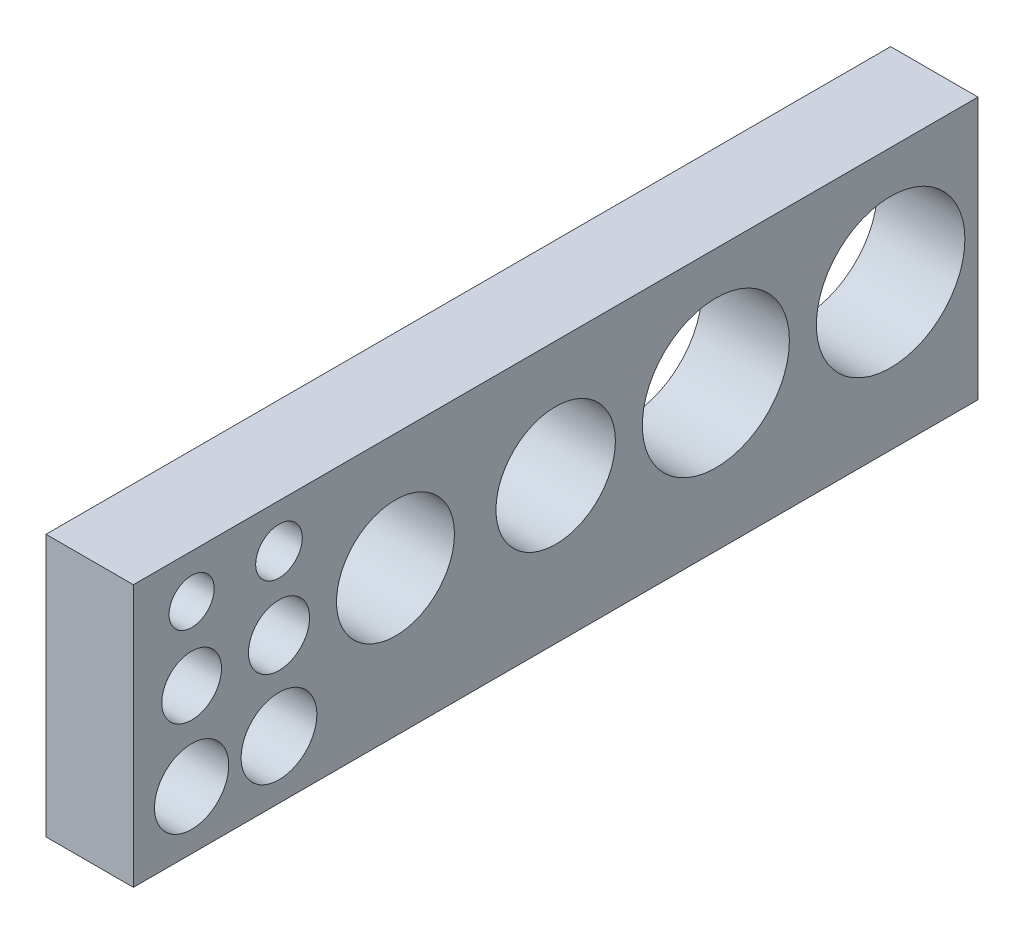
ISO-10303-21;
HEADER;
FILE_DESCRIPTION(('STEP AP214'),'2;1');
FILE_NAME('part.step','',(''),(''),'','','');
FILE_SCHEMA(('AUTOMOTIVE_DESIGN { 1 0 10303 214 1 1 1 1 }'));
ENDSEC;
DATA;
#1=APPLICATION_CONTEXT('core data for automotive mechanical design processes');
#2=APPLICATION_PROTOCOL_DEFINITION('international standard','automotive_design',2000,#1);
#3=PRODUCT_CONTEXT('',#1,'mechanical');
#4=PRODUCT('Part','Part','',(#3));
#5=PRODUCT_RELATED_PRODUCT_CATEGORY('part','',(#4));
#6=PRODUCT_DEFINITION_FORMATION('','',#4);
#7=PRODUCT_DEFINITION_CONTEXT('part definition',#1,'design');
#8=PRODUCT_DEFINITION('design','',#6,#7);
#9=PRODUCT_DEFINITION_SHAPE('','',#8);
#10=(LENGTH_UNIT() NAMED_UNIT(*) SI_UNIT(.MILLI.,.METRE.));
#11=(NAMED_UNIT(*) PLANE_ANGLE_UNIT() SI_UNIT($,.RADIAN.));
#12=(NAMED_UNIT(*) SI_UNIT($,.STERADIAN.) SOLID_ANGLE_UNIT());
#13=UNCERTAINTY_MEASURE_WITH_UNIT(LENGTH_MEASURE(1.E-05),#10,'distance_accuracy_value','');
#14=(GEOMETRIC_REPRESENTATION_CONTEXT(3) GLOBAL_UNCERTAINTY_ASSIGNED_CONTEXT((#13)) GLOBAL_UNIT_ASSIGNED_CONTEXT((#10,
#11,#12)) REPRESENTATION_CONTEXT('',''));
#15=CARTESIAN_POINT('',(0.,0.,0.));
#16=DIRECTION('',(0.,0.,1.));
#17=DIRECTION('',(1.,0.,0.));
#18=AXIS2_PLACEMENT_3D('',#15,#16,#17);
#19=CARTESIAN_POINT('',(6.,0.,0.));
#20=DIRECTION('',(1.,0.,0.));
#21=DIRECTION('',(0.,0.,-1.));
#22=AXIS2_PLACEMENT_3D('',#19,#20,#21);
#23=PLANE('',#22);
#24=CARTESIAN_POINT('',(6.,0.,-36.));
#25=DIRECTION('',(1.,0.,0.));
#26=DIRECTION('',(0.,0.,-1.));
#27=AXIS2_PLACEMENT_3D('',#24,#25,#26);
#28=CIRCLE('',#27,5.05);
#29=CARTESIAN_POINT('',(6.,0.,-41.05));
#30=VERTEX_POINT('',#29);
#31=EDGE_CURVE('E163',#30,#30,#28,.T.);
#32=ORIENTED_EDGE('',*,*,#31,.F.);
#33=EDGE_LOOP('',(#32));
#34=FACE_BOUND('',#33,.T.);
#35=CARTESIAN_POINT('',(6.,0.,-14.));
#36=DIRECTION('',(1.,0.,0.));
#37=DIRECTION('',(0.,0.,-1.));
#38=AXIS2_PLACEMENT_3D('',#35,#36,#37);
#39=CIRCLE('',#38,4.05);
#40=CARTESIAN_POINT('',(6.,0.,-18.05));
#41=VERTEX_POINT('',#40);
#42=EDGE_CURVE('E151',#41,#41,#39,.T.);
#43=ORIENTED_EDGE('',*,*,#42,.F.);
#44=EDGE_LOOP('',(#43));
#45=FACE_BOUND('',#44,.T.);
#46=CARTESIAN_POINT('',(6.,-6.,0.));
#47=DIRECTION('',(1.,0.,0.));
#48=DIRECTION('',(0.,0.,-1.));
#49=AXIS2_PLACEMENT_3D('',#46,#47,#48);
#50=CIRCLE('',#49,2.55);
#51=CARTESIAN_POINT('',(6.,-6.,-2.55));
#52=VERTEX_POINT('',#51);
#53=EDGE_CURVE('E139',#52,#52,#50,.T.);
#54=ORIENTED_EDGE('',*,*,#53,.F.);
#55=EDGE_LOOP('',(#54));
#56=FACE_BOUND('',#55,.T.);
#57=CARTESIAN_POINT('',(6.,5.,0.));
#58=DIRECTION('',(1.,0.,0.));
#59=DIRECTION('',(0.,0.,-1.));
#60=AXIS2_PLACEMENT_3D('',#57,#58,#59);
#61=CIRCLE('',#60,1.55);
#62=CARTESIAN_POINT('',(6.,5.,-1.55));
#63=VERTEX_POINT('',#62);
#64=EDGE_CURVE('E127',#63,#63,#61,.T.);
#65=ORIENTED_EDGE('',*,*,#64,.F.);
#66=EDGE_LOOP('',(#65));
#67=FACE_BOUND('',#66,.T.);
#68=CARTESIAN_POINT('',(6.,0.,0.));
#69=DIRECTION('',(1.,0.,0.));
#70=DIRECTION('',(0.,0.,-1.));
#71=AXIS2_PLACEMENT_3D('',#68,#69,#70);
#72=CIRCLE('',#71,2.05);
#73=CARTESIAN_POINT('',(6.,0.,-2.05));
#74=VERTEX_POINT('',#73);
#75=EDGE_CURVE('E106',#74,#74,#72,.T.);
#76=ORIENTED_EDGE('',*,*,#75,.F.);
#77=EDGE_LOOP('',(#76));
#78=FACE_BOUND('',#77,.T.);
#79=DIRECTION('',(0.,-1.,0.));
#80=VECTOR('',#79,1.);
#81=CARTESIAN_POINT('',(6.,8.,4.));
#82=LINE('',#81,#80);
#83=CARTESIAN_POINT('',(6.,8.,4.));
#84=VERTEX_POINT('',#83);
#85=CARTESIAN_POINT('',(6.,-10.,4.));
#86=VERTEX_POINT('',#85);
#87=EDGE_CURVE('E91',#84,#86,#82,.T.);
#88=ORIENTED_EDGE('',*,*,#87,.T.);
#89=DIRECTION('',(0.,0.,-1.));
#90=VECTOR('',#89,1.);
#91=CARTESIAN_POINT('',(6.,-10.,4.));
#92=LINE('',#91,#90);
#93=CARTESIAN_POINT('',(6.,-10.,-54.));
#94=VERTEX_POINT('',#93);
#95=EDGE_CURVE('E86',#86,#94,#92,.T.);
#96=ORIENTED_EDGE('',*,*,#95,.T.);
#97=DIRECTION('',(0.,1.,0.));
#98=VECTOR('',#97,1.);
#99=CARTESIAN_POINT('',(6.,8.,-54.));
#100=LINE('',#99,#98);
#101=CARTESIAN_POINT('',(6.,8.,-54.));
#102=VERTEX_POINT('',#101);
#103=EDGE_CURVE('E89',#94,#102,#100,.T.);
#104=ORIENTED_EDGE('',*,*,#103,.T.);
#105=DIRECTION('',(0.,0.,1.));
#106=VECTOR('',#105,1.);
#107=CARTESIAN_POINT('',(6.,8.,4.));
#108=LINE('',#107,#106);
#109=EDGE_CURVE('E56',#102,#84,#108,.T.);
#110=ORIENTED_EDGE('',*,*,#109,.T.);
#111=EDGE_LOOP('',(#88,#96,#104,#110));
#112=FACE_BOUND('',#111,.T.);
#113=CARTESIAN_POINT('',(6.,0.,-6.));
#114=DIRECTION('',(1.,0.,0.));
#115=DIRECTION('',(0.,0.,-1.));
#116=AXIS2_PLACEMENT_3D('',#113,#114,#115);
#117=CIRCLE('',#116,2.1);
#118=CARTESIAN_POINT('',(6.,0.,-8.1));
#119=VERTEX_POINT('',#118);
#120=EDGE_CURVE('E121',#119,#119,#117,.T.);
#121=ORIENTED_EDGE('',*,*,#120,.F.);
#122=EDGE_LOOP('',(#121));
#123=FACE_BOUND('',#122,.T.);
#124=CARTESIAN_POINT('',(6.,5.,-6.));
#125=DIRECTION('',(1.,0.,0.));
#126=DIRECTION('',(0.,0.,-1.));
#127=AXIS2_PLACEMENT_3D('',#124,#125,#126);
#128=CIRCLE('',#127,1.60000000000001);
#129=CARTESIAN_POINT('',(6.,5.,-7.6));
#130=VERTEX_POINT('',#129);
#131=EDGE_CURVE('E133',#130,#130,#128,.T.);
#132=ORIENTED_EDGE('',*,*,#131,.F.);
#133=EDGE_LOOP('',(#132));
#134=FACE_BOUND('',#133,.T.);
#135=CARTESIAN_POINT('',(6.,-6.,-6.));
#136=DIRECTION('',(1.,0.,0.));
#137=DIRECTION('',(0.,0.,-1.));
#138=AXIS2_PLACEMENT_3D('',#135,#136,#137);
#139=CIRCLE('',#138,2.6);
#140=CARTESIAN_POINT('',(6.,-6.,-8.6));
#141=VERTEX_POINT('',#140);
#142=EDGE_CURVE('E145',#141,#141,#139,.T.);
#143=ORIENTED_EDGE('',*,*,#142,.F.);
#144=EDGE_LOOP('',(#143));
#145=FACE_BOUND('',#144,.T.);
#146=CARTESIAN_POINT('',(6.,0.,-25.));
#147=DIRECTION('',(1.,0.,0.));
#148=DIRECTION('',(0.,0.,-1.));
#149=AXIS2_PLACEMENT_3D('',#146,#147,#148);
#150=CIRCLE('',#149,4.1);
#151=CARTESIAN_POINT('',(6.,0.,-29.1));
#152=VERTEX_POINT('',#151);
#153=EDGE_CURVE('E157',#152,#152,#150,.T.);
#154=ORIENTED_EDGE('',*,*,#153,.F.);
#155=EDGE_LOOP('',(#154));
#156=FACE_BOUND('',#155,.T.);
#157=CARTESIAN_POINT('',(6.,0.,-48.));
#158=DIRECTION('',(1.,0.,0.));
#159=DIRECTION('',(0.,0.,-1.));
#160=AXIS2_PLACEMENT_3D('',#157,#158,#159);
#161=CIRCLE('',#160,5.1);
#162=CARTESIAN_POINT('',(6.,0.,-53.1));
#163=VERTEX_POINT('',#162);
#164=EDGE_CURVE('E169',#163,#163,#161,.T.);
#165=ORIENTED_EDGE('',*,*,#164,.F.);
#166=EDGE_LOOP('',(#165));
#167=FACE_BOUND('',#166,.T.);
#168=ADVANCED_FACE('F39',(#34,#45,#56,#67,#78,#112,#123,#134,#145,#156,#167),#23,.T.);
#169=CARTESIAN_POINT('',(0.,0.,0.));
#170=DIRECTION('',(1.,0.,0.));
#171=DIRECTION('',(0.,0.,-1.));
#172=AXIS2_PLACEMENT_3D('',#169,#170,#171);
#173=PLANE('',#172);
#174=DIRECTION('',(0.,-1.,0.));
#175=VECTOR('',#174,1.);
#176=CARTESIAN_POINT('',(0.,8.,4.));
#177=LINE('',#176,#175);
#178=CARTESIAN_POINT('',(0.,8.,4.));
#179=VERTEX_POINT('',#178);
#180=CARTESIAN_POINT('',(0.,-10.,4.));
#181=VERTEX_POINT('',#180);
#182=EDGE_CURVE('E103',#179,#181,#177,.T.);
#183=ORIENTED_EDGE('',*,*,#182,.F.);
#184=DIRECTION('',(0.,0.,1.));
#185=VECTOR('',#184,1.);
#186=CARTESIAN_POINT('',(0.,8.,4.));
#187=LINE('',#186,#185);
#188=CARTESIAN_POINT('',(0.,8.,-54.));
#189=VERTEX_POINT('',#188);
#190=EDGE_CURVE('E79',#189,#179,#187,.T.);
#191=ORIENTED_EDGE('',*,*,#190,.F.);
#192=DIRECTION('',(0.,1.,0.));
#193=VECTOR('',#192,1.);
#194=CARTESIAN_POINT('',(0.,8.,-54.));
#195=LINE('',#194,#193);
#196=CARTESIAN_POINT('',(0.,-10.,-54.));
#197=VERTEX_POINT('',#196);
#198=EDGE_CURVE('E73',#197,#189,#195,.T.);
#199=ORIENTED_EDGE('',*,*,#198,.F.);
#200=DIRECTION('',(0.,0.,-1.));
#201=VECTOR('',#200,1.);
#202=CARTESIAN_POINT('',(0.,-10.,4.));
#203=LINE('',#202,#201);
#204=EDGE_CURVE('E95',#181,#197,#203,.T.);
#205=ORIENTED_EDGE('',*,*,#204,.F.);
#206=EDGE_LOOP('',(#183,#191,#199,#205));
#207=FACE_BOUND('',#206,.T.);
#208=CARTESIAN_POINT('',(0.,0.,0.));
#209=DIRECTION('',(1.,0.,0.));
#210=DIRECTION('',(0.,0.,-1.));
#211=AXIS2_PLACEMENT_3D('',#208,#209,#210);
#212=CIRCLE('',#211,2.05);
#213=CARTESIAN_POINT('',(0.,0.,-2.05));
#214=VERTEX_POINT('',#213);
#215=EDGE_CURVE('E118',#214,#214,#212,.T.);
#216=ORIENTED_EDGE('',*,*,#215,.T.);
#217=EDGE_LOOP('',(#216));
#218=FACE_BOUND('',#217,.T.);
#219=CARTESIAN_POINT('',(0.,0.,-6.));
#220=DIRECTION('',(1.,0.,0.));
#221=DIRECTION('',(0.,0.,-1.));
#222=AXIS2_PLACEMENT_3D('',#219,#220,#221);
#223=CIRCLE('',#222,2.1);
#224=CARTESIAN_POINT('',(0.,0.,-8.1));
#225=VERTEX_POINT('',#224);
#226=EDGE_CURVE('E124',#225,#225,#223,.T.);
#227=ORIENTED_EDGE('',*,*,#226,.T.);
#228=EDGE_LOOP('',(#227));
#229=FACE_BOUND('',#228,.T.);
#230=CARTESIAN_POINT('',(0.,5.,0.));
#231=DIRECTION('',(1.,0.,0.));
#232=DIRECTION('',(0.,0.,-1.));
#233=AXIS2_PLACEMENT_3D('',#230,#231,#232);
#234=CIRCLE('',#233,1.55);
#235=CARTESIAN_POINT('',(0.,5.,-1.55));
#236=VERTEX_POINT('',#235);
#237=EDGE_CURVE('E130',#236,#236,#234,.T.);
#238=ORIENTED_EDGE('',*,*,#237,.T.);
#239=EDGE_LOOP('',(#238));
#240=FACE_BOUND('',#239,.T.);
#241=CARTESIAN_POINT('',(0.,5.,-6.));
#242=DIRECTION('',(1.,0.,0.));
#243=DIRECTION('',(0.,0.,-1.));
#244=AXIS2_PLACEMENT_3D('',#241,#242,#243);
#245=CIRCLE('',#244,1.60000000000001);
#246=CARTESIAN_POINT('',(0.,5.,-7.6));
#247=VERTEX_POINT('',#246);
#248=EDGE_CURVE('E136',#247,#247,#245,.T.);
#249=ORIENTED_EDGE('',*,*,#248,.T.);
#250=EDGE_LOOP('',(#249));
#251=FACE_BOUND('',#250,.T.);
#252=CARTESIAN_POINT('',(0.,-6.,0.));
#253=DIRECTION('',(1.,0.,0.));
#254=DIRECTION('',(0.,0.,-1.));
#255=AXIS2_PLACEMENT_3D('',#252,#253,#254);
#256=CIRCLE('',#255,2.55);
#257=CARTESIAN_POINT('',(0.,-6.,-2.55));
#258=VERTEX_POINT('',#257);
#259=EDGE_CURVE('E142',#258,#258,#256,.T.);
#260=ORIENTED_EDGE('',*,*,#259,.T.);
#261=EDGE_LOOP('',(#260));
#262=FACE_BOUND('',#261,.T.);
#263=CARTESIAN_POINT('',(0.,-6.,-6.));
#264=DIRECTION('',(1.,0.,0.));
#265=DIRECTION('',(0.,0.,-1.));
#266=AXIS2_PLACEMENT_3D('',#263,#264,#265);
#267=CIRCLE('',#266,2.6);
#268=CARTESIAN_POINT('',(0.,-6.,-8.6));
#269=VERTEX_POINT('',#268);
#270=EDGE_CURVE('E148',#269,#269,#267,.T.);
#271=ORIENTED_EDGE('',*,*,#270,.T.);
#272=EDGE_LOOP('',(#271));
#273=FACE_BOUND('',#272,.T.);
#274=CARTESIAN_POINT('',(0.,0.,-14.));
#275=DIRECTION('',(1.,0.,0.));
#276=DIRECTION('',(0.,0.,-1.));
#277=AXIS2_PLACEMENT_3D('',#274,#275,#276);
#278=CIRCLE('',#277,4.05);
#279=CARTESIAN_POINT('',(0.,0.,-18.05));
#280=VERTEX_POINT('',#279);
#281=EDGE_CURVE('E154',#280,#280,#278,.T.);
#282=ORIENTED_EDGE('',*,*,#281,.T.);
#283=EDGE_LOOP('',(#282));
#284=FACE_BOUND('',#283,.T.);
#285=CARTESIAN_POINT('',(0.,0.,-25.));
#286=DIRECTION('',(1.,0.,0.));
#287=DIRECTION('',(0.,0.,-1.));
#288=AXIS2_PLACEMENT_3D('',#285,#286,#287);
#289=CIRCLE('',#288,4.1);
#290=CARTESIAN_POINT('',(0.,0.,-29.1));
#291=VERTEX_POINT('',#290);
#292=EDGE_CURVE('E160',#291,#291,#289,.T.);
#293=ORIENTED_EDGE('',*,*,#292,.T.);
#294=EDGE_LOOP('',(#293));
#295=FACE_BOUND('',#294,.T.);
#296=CARTESIAN_POINT('',(0.,0.,-36.));
#297=DIRECTION('',(1.,0.,0.));
#298=DIRECTION('',(0.,0.,-1.));
#299=AXIS2_PLACEMENT_3D('',#296,#297,#298);
#300=CIRCLE('',#299,5.05);
#301=CARTESIAN_POINT('',(0.,0.,-41.05));
#302=VERTEX_POINT('',#301);
#303=EDGE_CURVE('E166',#302,#302,#300,.T.);
#304=ORIENTED_EDGE('',*,*,#303,.T.);
#305=EDGE_LOOP('',(#304));
#306=FACE_BOUND('',#305,.T.);
#307=CARTESIAN_POINT('',(0.,0.,-48.));
#308=DIRECTION('',(1.,0.,0.));
#309=DIRECTION('',(0.,0.,-1.));
#310=AXIS2_PLACEMENT_3D('',#307,#308,#309);
#311=CIRCLE('',#310,5.1);
#312=CARTESIAN_POINT('',(0.,0.,-53.1));
#313=VERTEX_POINT('',#312);
#314=EDGE_CURVE('E172',#313,#313,#311,.T.);
#315=ORIENTED_EDGE('',*,*,#314,.T.);
#316=EDGE_LOOP('',(#315));
#317=FACE_BOUND('',#316,.T.);
#318=ADVANCED_FACE('F114',(#207,#218,#229,#240,#251,#262,#273,#284,#295,#306,#317),#173,.F.);
#319=CARTESIAN_POINT('',(6.,8.,4.));
#320=DIRECTION('',(0.,0.,-1.));
#321=DIRECTION('',(0.,1.,0.));
#322=AXIS2_PLACEMENT_3D('',#319,#320,#321);
#323=PLANE('',#322);
#324=ORIENTED_EDGE('',*,*,#182,.T.);
#325=DIRECTION('',(-1.,0.,0.));
#326=VECTOR('',#325,1.);
#327=CARTESIAN_POINT('',(6.,-10.,4.));
#328=LINE('',#327,#326);
#329=EDGE_CURVE('E11',#86,#181,#328,.T.);
#330=ORIENTED_EDGE('',*,*,#329,.F.);
#331=ORIENTED_EDGE('',*,*,#87,.F.);
#332=DIRECTION('',(-1.,0.,0.));
#333=VECTOR('',#332,1.);
#334=CARTESIAN_POINT('',(6.,8.,4.));
#335=LINE('',#334,#333);
#336=EDGE_CURVE('E99',#84,#179,#335,.T.);
#337=ORIENTED_EDGE('',*,*,#336,.T.);
#338=EDGE_LOOP('',(#324,#330,#331,#337));
#339=FACE_BOUND('',#338,.T.);
#340=ADVANCED_FACE('F41',(#339),#323,.F.);
#341=CARTESIAN_POINT('',(6.,-10.,4.));
#342=DIRECTION('',(0.,1.,0.));
#343=DIRECTION('',(0.,0.,1.));
#344=AXIS2_PLACEMENT_3D('',#341,#342,#343);
#345=PLANE('',#344);
#346=ORIENTED_EDGE('',*,*,#204,.T.);
#347=DIRECTION('',(-1.,0.,0.));
#348=VECTOR('',#347,1.);
#349=CARTESIAN_POINT('',(6.,-10.,-54.));
#350=LINE('',#349,#348);
#351=EDGE_CURVE('E48',#94,#197,#350,.T.);
#352=ORIENTED_EDGE('',*,*,#351,.F.);
#353=ORIENTED_EDGE('',*,*,#95,.F.);
#354=ORIENTED_EDGE('',*,*,#329,.T.);
#355=EDGE_LOOP('',(#346,#352,#353,#354));
#356=FACE_BOUND('',#355,.T.);
#357=ADVANCED_FACE('F94',(#356),#345,.F.);
#358=CARTESIAN_POINT('',(6.,8.,-54.));
#359=DIRECTION('',(0.,0.,1.));
#360=DIRECTION('',(0.,-1.,0.));
#361=AXIS2_PLACEMENT_3D('',#358,#359,#360);
#362=PLANE('',#361);
#363=ORIENTED_EDGE('',*,*,#198,.T.);
#364=DIRECTION('',(-1.,0.,0.));
#365=VECTOR('',#364,1.);
#366=CARTESIAN_POINT('',(6.,8.,-54.));
#367=LINE('',#366,#365);
#368=EDGE_CURVE('E96',#102,#189,#367,.T.);
#369=ORIENTED_EDGE('',*,*,#368,.F.);
#370=ORIENTED_EDGE('',*,*,#103,.F.);
#371=ORIENTED_EDGE('',*,*,#351,.T.);
#372=EDGE_LOOP('',(#363,#369,#370,#371));
#373=FACE_BOUND('',#372,.T.);
#374=ADVANCED_FACE('F97',(#373),#362,.F.);
#375=CARTESIAN_POINT('',(6.,8.,4.));
#376=DIRECTION('',(0.,-1.,0.));
#377=DIRECTION('',(0.,0.,-1.));
#378=AXIS2_PLACEMENT_3D('',#375,#376,#377);
#379=PLANE('',#378);
#380=ORIENTED_EDGE('',*,*,#190,.T.);
#381=ORIENTED_EDGE('',*,*,#336,.F.);
#382=ORIENTED_EDGE('',*,*,#109,.F.);
#383=ORIENTED_EDGE('',*,*,#368,.T.);
#384=EDGE_LOOP('',(#380,#381,#382,#383));
#385=FACE_BOUND('',#384,.T.);
#386=ADVANCED_FACE('F111',(#385),#379,.F.);
#387=CARTESIAN_POINT('',(6.,0.,0.));
#388=DIRECTION('',(-1.,0.,0.));
#389=DIRECTION('',(0.,0.,1.));
#390=AXIS2_PLACEMENT_3D('',#387,#388,#389);
#391=CYLINDRICAL_SURFACE('',#390,2.05);
#392=ORIENTED_EDGE('',*,*,#75,.T.);
#393=EDGE_LOOP('',(#392));
#394=FACE_BOUND('',#393,.T.);
#395=ORIENTED_EDGE('',*,*,#215,.F.);
#396=EDGE_LOOP('',(#395));
#397=FACE_BOUND('',#396,.T.);
#398=ADVANCED_FACE('F191',(#394,#397),#391,.F.);
#399=CARTESIAN_POINT('',(6.,0.,-6.));
#400=DIRECTION('',(-1.,0.,0.));
#401=DIRECTION('',(0.,0.,1.));
#402=AXIS2_PLACEMENT_3D('',#399,#400,#401);
#403=CYLINDRICAL_SURFACE('',#402,2.1);
#404=ORIENTED_EDGE('',*,*,#120,.T.);
#405=EDGE_LOOP('',(#404));
#406=FACE_BOUND('',#405,.T.);
#407=ORIENTED_EDGE('',*,*,#226,.F.);
#408=EDGE_LOOP('',(#407));
#409=FACE_BOUND('',#408,.T.);
#410=ADVANCED_FACE('F245',(#406,#409),#403,.F.);
#411=CARTESIAN_POINT('',(6.,5.,0.));
#412=DIRECTION('',(-1.,0.,0.));
#413=DIRECTION('',(0.,0.,1.));
#414=AXIS2_PLACEMENT_3D('',#411,#412,#413);
#415=CYLINDRICAL_SURFACE('',#414,1.55);
#416=ORIENTED_EDGE('',*,*,#64,.T.);
#417=EDGE_LOOP('',(#416));
#418=FACE_BOUND('',#417,.T.);
#419=ORIENTED_EDGE('',*,*,#237,.F.);
#420=EDGE_LOOP('',(#419));
#421=FACE_BOUND('',#420,.T.);
#422=ADVANCED_FACE('F254',(#418,#421),#415,.F.);
#423=CARTESIAN_POINT('',(6.,5.,-6.));
#424=DIRECTION('',(-1.,0.,0.));
#425=DIRECTION('',(0.,0.,1.));
#426=AXIS2_PLACEMENT_3D('',#423,#424,#425);
#427=CYLINDRICAL_SURFACE('',#426,1.60000000000001);
#428=ORIENTED_EDGE('',*,*,#131,.T.);
#429=EDGE_LOOP('',(#428));
#430=FACE_BOUND('',#429,.T.);
#431=ORIENTED_EDGE('',*,*,#248,.F.);
#432=EDGE_LOOP('',(#431));
#433=FACE_BOUND('',#432,.T.);
#434=ADVANCED_FACE('F263',(#430,#433),#427,.F.);
#435=CARTESIAN_POINT('',(6.,-6.,0.));
#436=DIRECTION('',(-1.,0.,0.));
#437=DIRECTION('',(0.,0.,1.));
#438=AXIS2_PLACEMENT_3D('',#435,#436,#437);
#439=CYLINDRICAL_SURFACE('',#438,2.55);
#440=ORIENTED_EDGE('',*,*,#53,.T.);
#441=EDGE_LOOP('',(#440));
#442=FACE_BOUND('',#441,.T.);
#443=ORIENTED_EDGE('',*,*,#259,.F.);
#444=EDGE_LOOP('',(#443));
#445=FACE_BOUND('',#444,.T.);
#446=ADVANCED_FACE('F273',(#442,#445),#439,.F.);
#447=CARTESIAN_POINT('',(6.,-6.,-6.));
#448=DIRECTION('',(-1.,0.,0.));
#449=DIRECTION('',(0.,0.,1.));
#450=AXIS2_PLACEMENT_3D('',#447,#448,#449);
#451=CYLINDRICAL_SURFACE('',#450,2.6);
#452=ORIENTED_EDGE('',*,*,#142,.T.);
#453=EDGE_LOOP('',(#452));
#454=FACE_BOUND('',#453,.T.);
#455=ORIENTED_EDGE('',*,*,#270,.F.);
#456=EDGE_LOOP('',(#455));
#457=FACE_BOUND('',#456,.T.);
#458=ADVANCED_FACE('F283',(#454,#457),#451,.F.);
#459=CARTESIAN_POINT('',(6.,0.,-14.));
#460=DIRECTION('',(-1.,0.,0.));
#461=DIRECTION('',(0.,0.,1.));
#462=AXIS2_PLACEMENT_3D('',#459,#460,#461);
#463=CYLINDRICAL_SURFACE('',#462,4.05);
#464=ORIENTED_EDGE('',*,*,#42,.T.);
#465=EDGE_LOOP('',(#464));
#466=FACE_BOUND('',#465,.T.);
#467=ORIENTED_EDGE('',*,*,#281,.F.);
#468=EDGE_LOOP('',(#467));
#469=FACE_BOUND('',#468,.T.);
#470=ADVANCED_FACE('F293',(#466,#469),#463,.F.);
#471=CARTESIAN_POINT('',(6.,0.,-25.));
#472=DIRECTION('',(-1.,0.,0.));
#473=DIRECTION('',(0.,0.,1.));
#474=AXIS2_PLACEMENT_3D('',#471,#472,#473);
#475=CYLINDRICAL_SURFACE('',#474,4.1);
#476=ORIENTED_EDGE('',*,*,#153,.T.);
#477=EDGE_LOOP('',(#476));
#478=FACE_BOUND('',#477,.T.);
#479=ORIENTED_EDGE('',*,*,#292,.F.);
#480=EDGE_LOOP('',(#479));
#481=FACE_BOUND('',#480,.T.);
#482=ADVANCED_FACE('F303',(#478,#481),#475,.F.);
#483=CARTESIAN_POINT('',(6.,0.,-36.));
#484=DIRECTION('',(-1.,0.,0.));
#485=DIRECTION('',(0.,0.,1.));
#486=AXIS2_PLACEMENT_3D('',#483,#484,#485);
#487=CYLINDRICAL_SURFACE('',#486,5.05);
#488=ORIENTED_EDGE('',*,*,#31,.T.);
#489=EDGE_LOOP('',(#488));
#490=FACE_BOUND('',#489,.T.);
#491=ORIENTED_EDGE('',*,*,#303,.F.);
#492=EDGE_LOOP('',(#491));
#493=FACE_BOUND('',#492,.T.);
#494=ADVANCED_FACE('F313',(#490,#493),#487,.F.);
#495=CARTESIAN_POINT('',(6.,0.,-48.));
#496=DIRECTION('',(-1.,0.,0.));
#497=DIRECTION('',(0.,0.,1.));
#498=AXIS2_PLACEMENT_3D('',#495,#496,#497);
#499=CYLINDRICAL_SURFACE('',#498,5.1);
#500=ORIENTED_EDGE('',*,*,#164,.T.);
#501=EDGE_LOOP('',(#500));
#502=FACE_BOUND('',#501,.T.);
#503=ORIENTED_EDGE('',*,*,#314,.F.);
#504=EDGE_LOOP('',(#503));
#505=FACE_BOUND('',#504,.T.);
#506=ADVANCED_FACE('F178',(#502,#505),#499,.F.);
#507=CLOSED_SHELL('',(#168,#318,#340,#357,#374,#386,#398,#410,#422,#434,#446,#458,#470,#482,
#494,#506));
#508=MANIFOLD_SOLID_BREP('B2',#507);
#509=ADVANCED_BREP_SHAPE_REPRESENTATION('',(#18,#508),#14);
#510=SHAPE_DEFINITION_REPRESENTATION(#9,#509);
ENDSEC;
END-ISO-10303-21;
